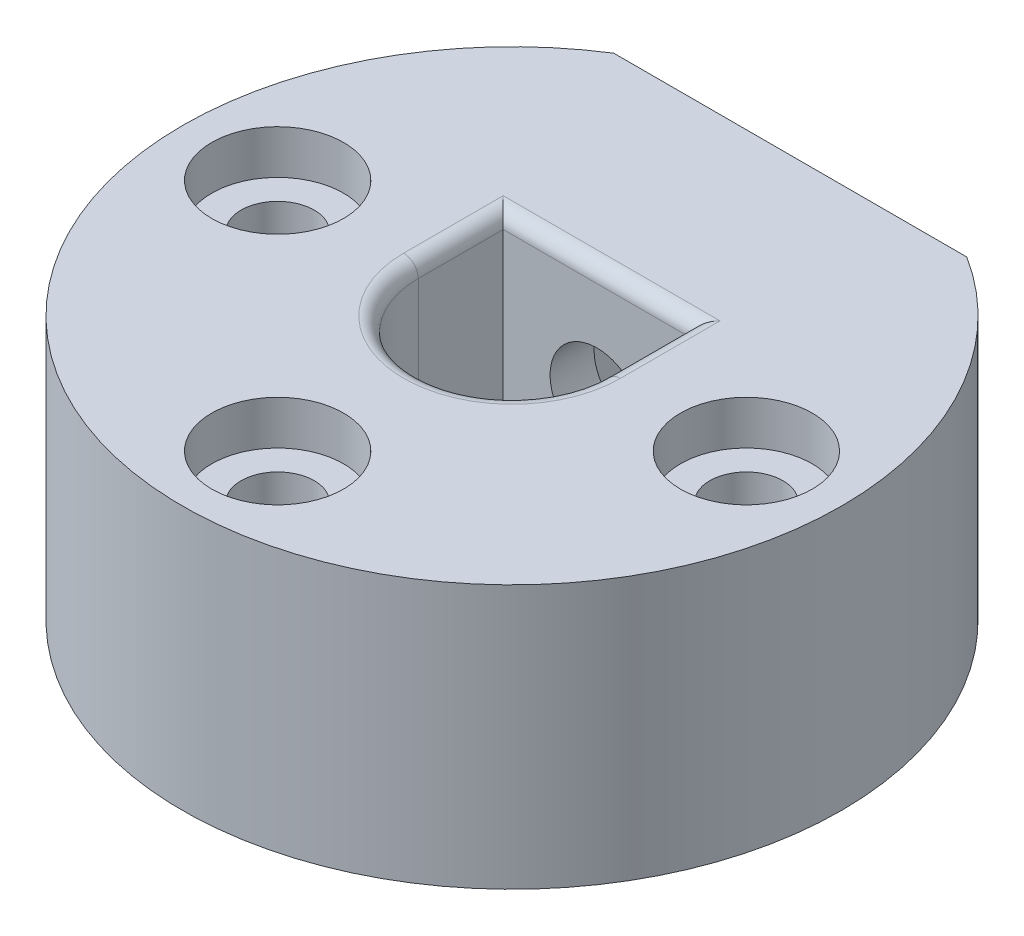
ISO-10303-21;
HEADER;
FILE_DESCRIPTION(('STEP AP214'),'2;1');
FILE_NAME('part.step','',(''),(''),'','','');
FILE_SCHEMA(('AUTOMOTIVE_DESIGN { 1 0 10303 214 1 1 1 1 }'));
ENDSEC;
DATA;
#1=APPLICATION_CONTEXT('core data for automotive mechanical design processes');
#2=APPLICATION_PROTOCOL_DEFINITION('international standard','automotive_design',2000,#1);
#3=PRODUCT_CONTEXT('',#1,'mechanical');
#4=PRODUCT('Part','Part','',(#3));
#5=PRODUCT_RELATED_PRODUCT_CATEGORY('part','',(#4));
#6=PRODUCT_DEFINITION_FORMATION('','',#4);
#7=PRODUCT_DEFINITION_CONTEXT('part definition',#1,'design');
#8=PRODUCT_DEFINITION('design','',#6,#7);
#9=PRODUCT_DEFINITION_SHAPE('','',#8);
#10=(LENGTH_UNIT() NAMED_UNIT(*) SI_UNIT(.MILLI.,.METRE.));
#11=(NAMED_UNIT(*) PLANE_ANGLE_UNIT() SI_UNIT($,.RADIAN.));
#12=(NAMED_UNIT(*) SI_UNIT($,.STERADIAN.) SOLID_ANGLE_UNIT());
#13=UNCERTAINTY_MEASURE_WITH_UNIT(LENGTH_MEASURE(1.E-05),#10,'distance_accuracy_value','');
#14=(GEOMETRIC_REPRESENTATION_CONTEXT(3) GLOBAL_UNCERTAINTY_ASSIGNED_CONTEXT((#13)) GLOBAL_UNIT_ASSIGNED_CONTEXT((#10,
#11,#12)) REPRESENTATION_CONTEXT('',''));
#15=CARTESIAN_POINT('',(0.,0.,0.));
#16=DIRECTION('',(0.,0.,1.));
#17=DIRECTION('',(1.,0.,0.));
#18=AXIS2_PLACEMENT_3D('',#15,#16,#17);
#19=CARTESIAN_POINT('',(0.,0.,0.));
#20=DIRECTION('',(0.,1.,0.));
#21=DIRECTION('',(0.,0.,1.));
#22=AXIS2_PLACEMENT_3D('',#19,#20,#21);
#23=PLANE('',#22);
#24=CARTESIAN_POINT('',(0.,0.,0.));
#25=DIRECTION('',(0.,1.,0.));
#26=DIRECTION('',(0.,0.,1.));
#27=AXIS2_PLACEMENT_3D('',#24,#25,#26);
#28=CIRCLE('',#27,3.2);
#29=CARTESIAN_POINT('',(-3.2,0.,0.));
#30=VERTEX_POINT('',#29);
#31=CARTESIAN_POINT('',(3.2,0.,0.));
#32=VERTEX_POINT('',#31);
#33=EDGE_CURVE('E219',#30,#32,#28,.T.);
#34=ORIENTED_EDGE('',*,*,#33,.T.);
#35=DIRECTION('',(0.,0.,-1.));
#36=VECTOR('',#35,1.);
#37=CARTESIAN_POINT('',(3.2,0.,0.));
#38=LINE('',#37,#36);
#39=CARTESIAN_POINT('',(3.2,0.,-2.9));
#40=VERTEX_POINT('',#39);
#41=EDGE_CURVE('E223',#32,#40,#38,.T.);
#42=ORIENTED_EDGE('',*,*,#41,.T.);
#43=DIRECTION('',(-1.,0.,0.));
#44=VECTOR('',#43,1.);
#45=CARTESIAN_POINT('',(3.2,0.,-2.9));
#46=LINE('',#45,#44);
#47=CARTESIAN_POINT('',(-3.2,0.,-2.9));
#48=VERTEX_POINT('',#47);
#49=EDGE_CURVE('E227',#40,#48,#46,.T.);
#50=ORIENTED_EDGE('',*,*,#49,.T.);
#51=DIRECTION('',(0.,0.,1.));
#52=VECTOR('',#51,1.);
#53=CARTESIAN_POINT('',(-3.2,0.,0.));
#54=LINE('',#53,#52);
#55=EDGE_CURVE('E231',#48,#30,#54,.T.);
#56=ORIENTED_EDGE('',*,*,#55,.T.);
#57=EDGE_LOOP('',(#34,#42,#50,#56));
#58=FACE_BOUND('',#57,.T.);
#59=CARTESIAN_POINT('',(0.,0.,0.));
#60=DIRECTION('',(0.,1.,0.));
#61=DIRECTION('',(0.,0.,1.));
#62=AXIS2_PLACEMENT_3D('',#59,#60,#61);
#63=CIRCLE('',#62,11.25);
#64=CARTESIAN_POINT('',(-6.02598539659698,0.,-9.5));
#65=VERTEX_POINT('',#64);
#66=CARTESIAN_POINT('',(6.02598539659698,0.,-9.5));
#67=VERTEX_POINT('',#66);
#68=EDGE_CURVE('E247',#65,#67,#63,.T.);
#69=ORIENTED_EDGE('',*,*,#68,.F.);
#70=DIRECTION('',(-1.,0.,0.));
#71=VECTOR('',#70,1.);
#72=CARTESIAN_POINT('',(6.02598539659698,0.,-9.5));
#73=LINE('',#72,#71);
#74=EDGE_CURVE('E253',#67,#65,#73,.T.);
#75=ORIENTED_EDGE('',*,*,#74,.F.);
#76=EDGE_LOOP('',(#69,#75));
#77=FACE_BOUND('',#76,.T.);
#78=CARTESIAN_POINT('',(0.,0.,8.));
#79=DIRECTION('',(0.,1.,0.));
#80=DIRECTION('',(0.,0.,1.));
#81=AXIS2_PLACEMENT_3D('',#78,#79,#80);
#82=CIRCLE('',#81,1.25);
#83=CARTESIAN_POINT('',(0.,0.,9.25));
#84=VERTEX_POINT('',#83);
#85=EDGE_CURVE('E215',#84,#84,#82,.T.);
#86=ORIENTED_EDGE('',*,*,#85,.T.);
#87=EDGE_LOOP('',(#86));
#88=FACE_BOUND('',#87,.T.);
#89=CARTESIAN_POINT('',(-8.,0.,-1.68080962984129E-13));
#90=DIRECTION('',(0.,1.,0.));
#91=DIRECTION('',(0.,0.,1.));
#92=AXIS2_PLACEMENT_3D('',#89,#90,#91);
#93=CIRCLE('',#92,1.25);
#94=CARTESIAN_POINT('',(-8.,0.,1.24999999999983));
#95=VERTEX_POINT('',#94);
#96=EDGE_CURVE('E199',#95,#95,#93,.T.);
#97=ORIENTED_EDGE('',*,*,#96,.T.);
#98=EDGE_LOOP('',(#97));
#99=FACE_BOUND('',#98,.T.);
#100=CARTESIAN_POINT('',(8.,0.,0.));
#101=DIRECTION('',(0.,1.,0.));
#102=DIRECTION('',(0.,0.,1.));
#103=AXIS2_PLACEMENT_3D('',#100,#101,#102);
#104=CIRCLE('',#103,1.25);
#105=CARTESIAN_POINT('',(8.,0.,1.25));
#106=VERTEX_POINT('',#105);
#107=EDGE_CURVE('E183',#106,#106,#104,.T.);
#108=ORIENTED_EDGE('',*,*,#107,.T.);
#109=EDGE_LOOP('',(#108));
#110=FACE_BOUND('',#109,.T.);
#111=DIRECTION('',(0.,0.,-1.));
#112=VECTOR('',#111,1.);
#113=CARTESIAN_POINT('',(2.925,0.,-4.4));
#114=LINE('',#113,#112);
#115=CARTESIAN_POINT('',(2.925,0.,-4.4));
#116=VERTEX_POINT('',#115);
#117=CARTESIAN_POINT('',(2.925,0.,-6.65));
#118=VERTEX_POINT('',#117);
#119=EDGE_CURVE('E57',#116,#118,#114,.T.);
#120=ORIENTED_EDGE('',*,*,#119,.T.);
#121=DIRECTION('',(-1.,0.,0.));
#122=VECTOR('',#121,1.);
#123=CARTESIAN_POINT('',(-2.925,0.,-6.65));
#124=LINE('',#123,#122);
#125=CARTESIAN_POINT('',(-2.925,0.,-6.65));
#126=VERTEX_POINT('',#125);
#127=EDGE_CURVE('E153',#118,#126,#124,.T.);
#128=ORIENTED_EDGE('',*,*,#127,.T.);
#129=DIRECTION('',(0.,0.,1.));
#130=VECTOR('',#129,1.);
#131=CARTESIAN_POINT('',(-2.925,0.,-4.4));
#132=LINE('',#131,#130);
#133=CARTESIAN_POINT('',(-2.925,0.,-4.4));
#134=VERTEX_POINT('',#133);
#135=EDGE_CURVE('E573',#126,#134,#132,.T.);
#136=ORIENTED_EDGE('',*,*,#135,.T.);
#137=DIRECTION('',(1.,0.,0.));
#138=VECTOR('',#137,1.);
#139=CARTESIAN_POINT('',(-2.925,0.,-4.4));
#140=LINE('',#139,#138);
#141=EDGE_CURVE('E148',#134,#116,#140,.T.);
#142=ORIENTED_EDGE('',*,*,#141,.T.);
#143=EDGE_LOOP('',(#120,#128,#136,#142));
#144=FACE_BOUND('',#143,.T.);
#145=ADVANCED_FACE('F39',(#58,#77,#88,#99,#110,#144),#23,.F.);
#146=CARTESIAN_POINT('',(0.,5.,-9.5));
#147=DIRECTION('',(0.,0.,1.));
#148=DIRECTION('',(1.,0.,0.));
#149=AXIS2_PLACEMENT_3D('',#146,#147,#148);
#150=CYLINDRICAL_SURFACE('',#149,1.6);
#151=CARTESIAN_POINT('',(0.,5.,-9.5));
#152=DIRECTION('',(0.,0.,1.));
#153=DIRECTION('',(1.,0.,0.));
#154=AXIS2_PLACEMENT_3D('',#151,#152,#153);
#155=CIRCLE('',#154,1.6);
#156=CARTESIAN_POINT('',(1.6,5.,-9.5));
#157=VERTEX_POINT('',#156);
#158=EDGE_CURVE('E165',#157,#157,#155,.T.);
#159=ORIENTED_EDGE('',*,*,#158,.F.);
#160=EDGE_LOOP('',(#159));
#161=FACE_BOUND('',#160,.T.);
#162=CARTESIAN_POINT('',(0.,5.,-6.65));
#163=DIRECTION('',(0.,0.,1.));
#164=DIRECTION('',(1.,0.,0.));
#165=AXIS2_PLACEMENT_3D('',#162,#163,#164);
#166=CIRCLE('',#165,1.6);
#167=CARTESIAN_POINT('',(1.6,5.,-6.65));
#168=VERTEX_POINT('',#167);
#169=EDGE_CURVE('E43',#168,#168,#166,.F.);
#170=ORIENTED_EDGE('',*,*,#169,.F.);
#171=EDGE_LOOP('',(#170));
#172=FACE_BOUND('',#171,.T.);
#173=ADVANCED_FACE('F350',(#161,#172),#150,.F.);
#174=CARTESIAN_POINT('',(0.,5.,-2.9));
#175=DIRECTION('',(0.,0.,1.));
#176=DIRECTION('',(1.,0.,0.));
#177=AXIS2_PLACEMENT_3D('',#174,#175,#176);
#178=CIRCLE('',#177,1.6);
#179=CARTESIAN_POINT('',(1.6,5.,-2.9));
#180=VERTEX_POINT('',#179);
#181=EDGE_CURVE('E169',#180,#180,#178,.T.);
#182=ORIENTED_EDGE('',*,*,#181,.T.);
#183=EDGE_LOOP('',(#182));
#184=FACE_BOUND('',#183,.T.);
#185=CARTESIAN_POINT('',(0.,5.,-4.4));
#186=DIRECTION('',(0.,0.,-1.));
#187=DIRECTION('',(-1.,0.,0.));
#188=AXIS2_PLACEMENT_3D('',#185,#186,#187);
#189=CIRCLE('',#188,1.6);
#190=CARTESIAN_POINT('',(-1.6,5.,-4.4));
#191=VERTEX_POINT('',#190);
#192=EDGE_CURVE('E155',#191,#191,#189,.F.);
#193=ORIENTED_EDGE('',*,*,#192,.F.);
#194=EDGE_LOOP('',(#193));
#195=FACE_BOUND('',#194,.T.);
#196=ADVANCED_FACE('F307',(#184,#195),#150,.F.);
#197=CARTESIAN_POINT('',(0.,9.,0.));
#198=DIRECTION('',(0.,1.,0.));
#199=DIRECTION('',(0.,0.,1.));
#200=AXIS2_PLACEMENT_3D('',#197,#198,#199);
#201=PLANE('',#200);
#202=DIRECTION('',(0.,0.,1.));
#203=VECTOR('',#202,1.);
#204=CARTESIAN_POINT('',(-3.7,9.,0.));
#205=LINE('',#204,#203);
#206=CARTESIAN_POINT('',(-3.7,9.,0.));
#207=VERTEX_POINT('',#206);
#208=CARTESIAN_POINT('',(-3.7,9.,-3.4));
#209=VERTEX_POINT('',#208);
#210=EDGE_CURVE('E279',#207,#209,#205,.F.);
#211=ORIENTED_EDGE('',*,*,#210,.T.);
#212=DIRECTION('',(-1.,0.,0.));
#213=VECTOR('',#212,1.);
#214=CARTESIAN_POINT('',(0.,9.,-3.4));
#215=LINE('',#214,#213);
#216=CARTESIAN_POINT('',(3.7,9.,-3.4));
#217=VERTEX_POINT('',#216);
#218=EDGE_CURVE('E283',#209,#217,#215,.F.);
#219=ORIENTED_EDGE('',*,*,#218,.T.);
#220=DIRECTION('',(0.,0.,-1.));
#221=VECTOR('',#220,1.);
#222=CARTESIAN_POINT('',(3.7,9.,0.));
#223=LINE('',#222,#221);
#224=CARTESIAN_POINT('',(3.7,9.,0.));
#225=VERTEX_POINT('',#224);
#226=EDGE_CURVE('E276',#217,#225,#223,.F.);
#227=ORIENTED_EDGE('',*,*,#226,.T.);
#228=CARTESIAN_POINT('',(0.,9.,0.));
#229=DIRECTION('',(0.,1.,0.));
#230=DIRECTION('',(0.,0.,1.));
#231=AXIS2_PLACEMENT_3D('',#228,#229,#230);
#232=CIRCLE('',#231,3.7);
#233=EDGE_CURVE('E273',#225,#207,#232,.F.);
#234=ORIENTED_EDGE('',*,*,#233,.T.);
#235=EDGE_LOOP('',(#211,#219,#227,#234));
#236=FACE_BOUND('',#235,.T.);
#237=CARTESIAN_POINT('',(8.,9.,0.));
#238=DIRECTION('',(0.,1.,0.));
#239=DIRECTION('',(0.,0.,1.));
#240=AXIS2_PLACEMENT_3D('',#237,#238,#239);
#241=CIRCLE('',#240,2.25);
#242=CARTESIAN_POINT('',(8.,9.,2.25));
#243=VERTEX_POINT('',#242);
#244=EDGE_CURVE('E170',#243,#243,#241,.T.);
#245=ORIENTED_EDGE('',*,*,#244,.F.);
#246=EDGE_LOOP('',(#245));
#247=FACE_BOUND('',#246,.T.);
#248=CARTESIAN_POINT('',(-8.,9.,-1.68080962984129E-13));
#249=DIRECTION('',(0.,1.,0.));
#250=DIRECTION('',(0.,0.,1.));
#251=AXIS2_PLACEMENT_3D('',#248,#249,#250);
#252=CIRCLE('',#251,2.25);
#253=CARTESIAN_POINT('',(-8.,9.,2.24999999999983));
#254=VERTEX_POINT('',#253);
#255=EDGE_CURVE('E187',#254,#254,#252,.T.);
#256=ORIENTED_EDGE('',*,*,#255,.F.);
#257=EDGE_LOOP('',(#256));
#258=FACE_BOUND('',#257,.T.);
#259=CARTESIAN_POINT('',(0.,9.,8.));
#260=DIRECTION('',(0.,1.,0.));
#261=DIRECTION('',(0.,0.,1.));
#262=AXIS2_PLACEMENT_3D('',#259,#260,#261);
#263=CIRCLE('',#262,2.25);
#264=CARTESIAN_POINT('',(0.,9.,10.25));
#265=VERTEX_POINT('',#264);
#266=EDGE_CURVE('E203',#265,#265,#263,.T.);
#267=ORIENTED_EDGE('',*,*,#266,.F.);
#268=EDGE_LOOP('',(#267));
#269=FACE_BOUND('',#268,.T.);
#270=CARTESIAN_POINT('',(0.,9.,0.));
#271=DIRECTION('',(0.,1.,0.));
#272=DIRECTION('',(0.,0.,1.));
#273=AXIS2_PLACEMENT_3D('',#270,#271,#272);
#274=CIRCLE('',#273,11.25);
#275=CARTESIAN_POINT('',(-6.02598539659698,9.,-9.5));
#276=VERTEX_POINT('',#275);
#277=CARTESIAN_POINT('',(6.02598539659698,9.,-9.5));
#278=VERTEX_POINT('',#277);
#279=EDGE_CURVE('E248',#276,#278,#274,.T.);
#280=ORIENTED_EDGE('',*,*,#279,.T.);
#281=DIRECTION('',(-1.,0.,0.));
#282=VECTOR('',#281,1.);
#283=CARTESIAN_POINT('',(6.02598539659698,9.,-9.5));
#284=LINE('',#283,#282);
#285=EDGE_CURVE('E252',#278,#276,#284,.T.);
#286=ORIENTED_EDGE('',*,*,#285,.T.);
#287=EDGE_LOOP('',(#280,#286));
#288=FACE_BOUND('',#287,.T.);
#289=ADVANCED_FACE('F359',(#236,#247,#258,#269,#288),#201,.T.);
#290=CARTESIAN_POINT('',(0.,9.,0.));
#291=DIRECTION('',(0.,-1.,0.));
#292=DIRECTION('',(0.,0.,-1.));
#293=AXIS2_PLACEMENT_3D('',#290,#291,#292);
#294=CYLINDRICAL_SURFACE('',#293,11.25);
#295=ORIENTED_EDGE('',*,*,#68,.T.);
#296=DIRECTION('',(0.,-1.,0.));
#297=VECTOR('',#296,1.);
#298=CARTESIAN_POINT('',(6.02598539659698,9.,-9.5));
#299=LINE('',#298,#297);
#300=EDGE_CURVE('E265',#278,#67,#299,.T.);
#301=ORIENTED_EDGE('',*,*,#300,.F.);
#302=ORIENTED_EDGE('',*,*,#279,.F.);
#303=DIRECTION('',(0.,-1.,0.));
#304=VECTOR('',#303,1.);
#305=CARTESIAN_POINT('',(-6.02598539659698,9.,-9.5));
#306=LINE('',#305,#304);
#307=EDGE_CURVE('E256',#276,#65,#306,.T.);
#308=ORIENTED_EDGE('',*,*,#307,.T.);
#309=EDGE_LOOP('',(#295,#301,#302,#308));
#310=FACE_BOUND('',#309,.T.);
#311=ADVANCED_FACE('F362',(#310),#294,.T.);
#312=CARTESIAN_POINT('',(6.02598539659698,9.,-9.5));
#313=DIRECTION('',(0.,0.,1.));
#314=DIRECTION('',(1.,0.,0.));
#315=AXIS2_PLACEMENT_3D('',#312,#313,#314);
#316=PLANE('',#315);
#317=ORIENTED_EDGE('',*,*,#158,.T.);
#318=EDGE_LOOP('',(#317));
#319=FACE_BOUND('',#318,.T.);
#320=ORIENTED_EDGE('',*,*,#74,.T.);
#321=ORIENTED_EDGE('',*,*,#307,.F.);
#322=ORIENTED_EDGE('',*,*,#285,.F.);
#323=ORIENTED_EDGE('',*,*,#300,.T.);
#324=EDGE_LOOP('',(#320,#321,#322,#323));
#325=FACE_BOUND('',#324,.T.);
#326=ADVANCED_FACE('F347',(#319,#325),#316,.F.);
#327=CARTESIAN_POINT('',(0.,9.,0.));
#328=DIRECTION('',(0.,-1.,0.));
#329=DIRECTION('',(0.,0.,-1.));
#330=AXIS2_PLACEMENT_3D('',#327,#328,#329);
#331=CYLINDRICAL_SURFACE('',#330,3.2);
#332=DIRECTION('',(0.,-1.,0.));
#333=VECTOR('',#332,1.);
#334=CARTESIAN_POINT('',(-3.2,9.,0.));
#335=LINE('',#334,#333);
#336=CARTESIAN_POINT('',(-3.2,8.5,0.));
#337=VERTEX_POINT('',#336);
#338=EDGE_CURVE('E235',#337,#30,#335,.T.);
#339=ORIENTED_EDGE('',*,*,#338,.F.);
#340=CARTESIAN_POINT('',(0.,8.5,0.));
#341=DIRECTION('',(0.,1.,0.));
#342=DIRECTION('',(0.,0.,1.));
#343=AXIS2_PLACEMENT_3D('',#340,#341,#342);
#344=CIRCLE('',#343,3.2);
#345=CARTESIAN_POINT('',(3.2,8.5,0.));
#346=VERTEX_POINT('',#345);
#347=EDGE_CURVE('E11',#337,#346,#344,.T.);
#348=ORIENTED_EDGE('',*,*,#347,.T.);
#349=DIRECTION('',(0.,-1.,0.));
#350=VECTOR('',#349,1.);
#351=CARTESIAN_POINT('',(3.2,9.,0.));
#352=LINE('',#351,#350);
#353=EDGE_CURVE('E244',#346,#32,#352,.T.);
#354=ORIENTED_EDGE('',*,*,#353,.T.);
#355=ORIENTED_EDGE('',*,*,#33,.F.);
#356=EDGE_LOOP('',(#339,#348,#354,#355));
#357=FACE_BOUND('',#356,.T.);
#358=ADVANCED_FACE('F339',(#357),#331,.F.);
#359=CARTESIAN_POINT('',(3.2,9.,0.));
#360=DIRECTION('',(-1.,0.,0.));
#361=DIRECTION('',(0.,0.,1.));
#362=AXIS2_PLACEMENT_3D('',#359,#360,#361);
#363=PLANE('',#362);
#364=ORIENTED_EDGE('',*,*,#353,.F.);
#365=DIRECTION('',(0.,0.,-1.));
#366=VECTOR('',#365,1.);
#367=CARTESIAN_POINT('',(3.2,8.5,0.));
#368=LINE('',#367,#366);
#369=CARTESIAN_POINT('',(3.2,8.5,-2.9));
#370=VERTEX_POINT('',#369);
#371=EDGE_CURVE('E65',#346,#370,#368,.T.);
#372=ORIENTED_EDGE('',*,*,#371,.T.);
#373=DIRECTION('',(0.,-1.,0.));
#374=VECTOR('',#373,1.);
#375=CARTESIAN_POINT('',(3.2,9.,-2.9));
#376=LINE('',#375,#374);
#377=EDGE_CURVE('E241',#370,#40,#376,.T.);
#378=ORIENTED_EDGE('',*,*,#377,.T.);
#379=ORIENTED_EDGE('',*,*,#41,.F.);
#380=EDGE_LOOP('',(#364,#372,#378,#379));
#381=FACE_BOUND('',#380,.T.);
#382=ADVANCED_FACE('F314',(#381),#363,.T.);
#383=CARTESIAN_POINT('',(3.2,9.,-2.9));
#384=DIRECTION('',(0.,0.,1.));
#385=DIRECTION('',(1.,0.,0.));
#386=AXIS2_PLACEMENT_3D('',#383,#384,#385);
#387=PLANE('',#386);
#388=ORIENTED_EDGE('',*,*,#181,.F.);
#389=EDGE_LOOP('',(#388));
#390=FACE_BOUND('',#389,.T.);
#391=ORIENTED_EDGE('',*,*,#377,.F.);
#392=DIRECTION('',(-1.,0.,0.));
#393=VECTOR('',#392,1.);
#394=CARTESIAN_POINT('',(3.2,8.5,-2.9));
#395=LINE('',#394,#393);
#396=CARTESIAN_POINT('',(-3.2,8.5,-2.9));
#397=VERTEX_POINT('',#396);
#398=EDGE_CURVE('E49',#370,#397,#395,.T.);
#399=ORIENTED_EDGE('',*,*,#398,.T.);
#400=DIRECTION('',(0.,-1.,0.));
#401=VECTOR('',#400,1.);
#402=CARTESIAN_POINT('',(-3.2,9.,-2.9));
#403=LINE('',#402,#401);
#404=EDGE_CURVE('E238',#397,#48,#403,.T.);
#405=ORIENTED_EDGE('',*,*,#404,.T.);
#406=ORIENTED_EDGE('',*,*,#49,.F.);
#407=EDGE_LOOP('',(#391,#399,#405,#406));
#408=FACE_BOUND('',#407,.T.);
#409=ADVANCED_FACE('F310',(#390,#408),#387,.T.);
#410=CARTESIAN_POINT('',(-3.2,9.,0.));
#411=DIRECTION('',(1.,0.,0.));
#412=DIRECTION('',(0.,0.,-1.));
#413=AXIS2_PLACEMENT_3D('',#410,#411,#412);
#414=PLANE('',#413);
#415=ORIENTED_EDGE('',*,*,#404,.F.);
#416=DIRECTION('',(0.,0.,1.));
#417=VECTOR('',#416,1.);
#418=CARTESIAN_POINT('',(-3.2,8.5,0.));
#419=LINE('',#418,#417);
#420=EDGE_CURVE('E269',#397,#337,#419,.T.);
#421=ORIENTED_EDGE('',*,*,#420,.T.);
#422=ORIENTED_EDGE('',*,*,#338,.T.);
#423=ORIENTED_EDGE('',*,*,#55,.F.);
#424=EDGE_LOOP('',(#415,#421,#422,#423));
#425=FACE_BOUND('',#424,.T.);
#426=ADVANCED_FACE('F313',(#425),#414,.T.);
#427=CARTESIAN_POINT('',(0.,9.,8.));
#428=DIRECTION('',(0.,1.,0.));
#429=DIRECTION('',(0.,0.,1.));
#430=AXIS2_PLACEMENT_3D('',#427,#428,#429);
#431=CYLINDRICAL_SURFACE('',#430,1.25);
#432=ORIENTED_EDGE('',*,*,#85,.F.);
#433=EDGE_LOOP('',(#432));
#434=FACE_BOUND('',#433,.T.);
#435=CARTESIAN_POINT('',(0.,7.5,8.));
#436=DIRECTION('',(0.,1.,0.));
#437=DIRECTION('',(0.,0.,1.));
#438=AXIS2_PLACEMENT_3D('',#435,#436,#437);
#439=CIRCLE('',#438,1.25);
#440=CARTESIAN_POINT('',(0.,7.5,9.25));
#441=VERTEX_POINT('',#440);
#442=EDGE_CURVE('E211',#441,#441,#439,.T.);
#443=ORIENTED_EDGE('',*,*,#442,.T.);
#444=EDGE_LOOP('',(#443));
#445=FACE_BOUND('',#444,.T.);
#446=ADVANCED_FACE('F415',(#434,#445),#431,.F.);
#447=CARTESIAN_POINT('',(1.24999999999997,7.5,8.));
#448=DIRECTION('',(0.,-1.,0.));
#449=DIRECTION('',(0.,0.,-1.));
#450=AXIS2_PLACEMENT_3D('',#447,#448,#449);
#451=PLANE('',#450);
#452=ORIENTED_EDGE('',*,*,#442,.F.);
#453=EDGE_LOOP('',(#452));
#454=FACE_BOUND('',#453,.T.);
#455=CARTESIAN_POINT('',(0.,7.5,8.));
#456=DIRECTION('',(0.,1.,0.));
#457=DIRECTION('',(0.,0.,1.));
#458=AXIS2_PLACEMENT_3D('',#455,#456,#457);
#459=CIRCLE('',#458,2.25);
#460=CARTESIAN_POINT('',(0.,7.5,10.25));
#461=VERTEX_POINT('',#460);
#462=EDGE_CURVE('E207',#461,#461,#459,.T.);
#463=ORIENTED_EDGE('',*,*,#462,.T.);
#464=EDGE_LOOP('',(#463));
#465=FACE_BOUND('',#464,.T.);
#466=ADVANCED_FACE('F411',(#454,#465),#451,.F.);
#467=CARTESIAN_POINT('',(0.,9.,8.));
#468=DIRECTION('',(0.,1.,0.));
#469=DIRECTION('',(0.,0.,1.));
#470=AXIS2_PLACEMENT_3D('',#467,#468,#469);
#471=CYLINDRICAL_SURFACE('',#470,2.25);
#472=ORIENTED_EDGE('',*,*,#462,.F.);
#473=EDGE_LOOP('',(#472));
#474=FACE_BOUND('',#473,.T.);
#475=ORIENTED_EDGE('',*,*,#266,.T.);
#476=EDGE_LOOP('',(#475));
#477=FACE_BOUND('',#476,.T.);
#478=ADVANCED_FACE('F407',(#474,#477),#471,.F.);
#479=CARTESIAN_POINT('',(-8.,9.,-1.68080962984129E-13));
#480=DIRECTION('',(0.,1.,0.));
#481=DIRECTION('',(0.,0.,1.));
#482=AXIS2_PLACEMENT_3D('',#479,#480,#481);
#483=CYLINDRICAL_SURFACE('',#482,1.25);
#484=ORIENTED_EDGE('',*,*,#96,.F.);
#485=EDGE_LOOP('',(#484));
#486=FACE_BOUND('',#485,.T.);
#487=CARTESIAN_POINT('',(-8.,7.5,-1.68080962984129E-13));
#488=DIRECTION('',(0.,1.,0.));
#489=DIRECTION('',(0.,0.,1.));
#490=AXIS2_PLACEMENT_3D('',#487,#488,#489);
#491=CIRCLE('',#490,1.25);
#492=CARTESIAN_POINT('',(-8.,7.5,1.24999999999983));
#493=VERTEX_POINT('',#492);
#494=EDGE_CURVE('E195',#493,#493,#491,.T.);
#495=ORIENTED_EDGE('',*,*,#494,.T.);
#496=EDGE_LOOP('',(#495));
#497=FACE_BOUND('',#496,.T.);
#498=ADVANCED_FACE('F403',(#486,#497),#483,.F.);
#499=CARTESIAN_POINT('',(-6.75,7.5,-1.68080962984129E-13));
#500=DIRECTION('',(0.,-1.,0.));
#501=DIRECTION('',(0.,0.,-1.));
#502=AXIS2_PLACEMENT_3D('',#499,#500,#501);
#503=PLANE('',#502);
#504=ORIENTED_EDGE('',*,*,#494,.F.);
#505=EDGE_LOOP('',(#504));
#506=FACE_BOUND('',#505,.T.);
#507=CARTESIAN_POINT('',(-8.,7.5,-1.68080962984129E-13));
#508=DIRECTION('',(0.,1.,0.));
#509=DIRECTION('',(0.,0.,1.));
#510=AXIS2_PLACEMENT_3D('',#507,#508,#509);
#511=CIRCLE('',#510,2.25);
#512=CARTESIAN_POINT('',(-8.,7.5,2.24999999999983));
#513=VERTEX_POINT('',#512);
#514=EDGE_CURVE('E191',#513,#513,#511,.T.);
#515=ORIENTED_EDGE('',*,*,#514,.T.);
#516=EDGE_LOOP('',(#515));
#517=FACE_BOUND('',#516,.T.);
#518=ADVANCED_FACE('F399',(#506,#517),#503,.F.);
#519=CARTESIAN_POINT('',(-8.,9.,-1.68080962984129E-13));
#520=DIRECTION('',(0.,1.,0.));
#521=DIRECTION('',(0.,0.,1.));
#522=AXIS2_PLACEMENT_3D('',#519,#520,#521);
#523=CYLINDRICAL_SURFACE('',#522,2.25);
#524=ORIENTED_EDGE('',*,*,#514,.F.);
#525=EDGE_LOOP('',(#524));
#526=FACE_BOUND('',#525,.T.);
#527=ORIENTED_EDGE('',*,*,#255,.T.);
#528=EDGE_LOOP('',(#527));
#529=FACE_BOUND('',#528,.T.);
#530=ADVANCED_FACE('F395',(#526,#529),#523,.F.);
#531=CARTESIAN_POINT('',(8.,9.,0.));
#532=DIRECTION('',(0.,1.,0.));
#533=DIRECTION('',(0.,0.,1.));
#534=AXIS2_PLACEMENT_3D('',#531,#532,#533);
#535=CYLINDRICAL_SURFACE('',#534,1.25);
#536=ORIENTED_EDGE('',*,*,#107,.F.);
#537=EDGE_LOOP('',(#536));
#538=FACE_BOUND('',#537,.T.);
#539=CARTESIAN_POINT('',(8.,7.5,0.));
#540=DIRECTION('',(0.,1.,0.));
#541=DIRECTION('',(0.,0.,1.));
#542=AXIS2_PLACEMENT_3D('',#539,#540,#541);
#543=CIRCLE('',#542,1.25);
#544=CARTESIAN_POINT('',(8.,7.5,1.25));
#545=VERTEX_POINT('',#544);
#546=EDGE_CURVE('E179',#545,#545,#543,.T.);
#547=ORIENTED_EDGE('',*,*,#546,.T.);
#548=EDGE_LOOP('',(#547));
#549=FACE_BOUND('',#548,.T.);
#550=ADVANCED_FACE('F386',(#538,#549),#535,.F.);
#551=CARTESIAN_POINT('',(9.25,7.5,0.));
#552=DIRECTION('',(0.,-1.,0.));
#553=DIRECTION('',(0.,0.,-1.));
#554=AXIS2_PLACEMENT_3D('',#551,#552,#553);
#555=PLANE('',#554);
#556=ORIENTED_EDGE('',*,*,#546,.F.);
#557=EDGE_LOOP('',(#556));
#558=FACE_BOUND('',#557,.T.);
#559=CARTESIAN_POINT('',(8.,7.5,0.));
#560=DIRECTION('',(0.,1.,0.));
#561=DIRECTION('',(0.,0.,1.));
#562=AXIS2_PLACEMENT_3D('',#559,#560,#561);
#563=CIRCLE('',#562,2.25);
#564=CARTESIAN_POINT('',(8.,7.5,2.25));
#565=VERTEX_POINT('',#564);
#566=EDGE_CURVE('E174',#565,#565,#563,.T.);
#567=ORIENTED_EDGE('',*,*,#566,.T.);
#568=EDGE_LOOP('',(#567));
#569=FACE_BOUND('',#568,.T.);
#570=ADVANCED_FACE('F380',(#558,#569),#555,.F.);
#571=CARTESIAN_POINT('',(8.,9.,0.));
#572=DIRECTION('',(0.,1.,0.));
#573=DIRECTION('',(0.,0.,1.));
#574=AXIS2_PLACEMENT_3D('',#571,#572,#573);
#575=CYLINDRICAL_SURFACE('',#574,2.25);
#576=ORIENTED_EDGE('',*,*,#566,.F.);
#577=EDGE_LOOP('',(#576));
#578=FACE_BOUND('',#577,.T.);
#579=ORIENTED_EDGE('',*,*,#244,.T.);
#580=EDGE_LOOP('',(#579));
#581=FACE_BOUND('',#580,.T.);
#582=ADVANCED_FACE('F376',(#578,#581),#575,.F.);
#583=CARTESIAN_POINT('',(3.7,8.5,0.));
#584=DIRECTION('',(0.,0.,-1.));
#585=DIRECTION('',(-1.,0.,0.));
#586=AXIS2_PLACEMENT_3D('',#583,#584,#585);
#587=CYLINDRICAL_SURFACE('',#586,0.5);
#588=CARTESIAN_POINT('',(3.7,8.5,0.));
#589=DIRECTION('',(0.,0.,1.));
#590=DIRECTION('',(1.,0.,0.));
#591=AXIS2_PLACEMENT_3D('',#588,#589,#590);
#592=CIRCLE('',#591,0.5);
#593=EDGE_CURVE('E296',#225,#346,#592,.T.);
#594=ORIENTED_EDGE('',*,*,#593,.F.);
#595=ORIENTED_EDGE('',*,*,#226,.F.);
#596=CARTESIAN_POINT('',(3.7,8.5,-3.4));
#597=DIRECTION('',(-0.707106781186548,0.,-0.707106781186547));
#598=DIRECTION('',(0.707106781186547,0.,-0.707106781186548));
#599=AXIS2_PLACEMENT_3D('',#596,#597,#598);
#600=ELLIPSE('',#599,0.707106781186547,0.5);
#601=EDGE_CURVE('E175',#370,#217,#600,.T.);
#602=ORIENTED_EDGE('',*,*,#601,.F.);
#603=ORIENTED_EDGE('',*,*,#371,.F.);
#604=EDGE_LOOP('',(#594,#595,#602,#603));
#605=FACE_BOUND('',#604,.T.);
#606=ADVANCED_FACE('F41',(#605),#587,.T.);
#607=CARTESIAN_POINT('',(3.2,8.5,-3.4));
#608=DIRECTION('',(-1.,0.,0.));
#609=DIRECTION('',(0.,0.,1.));
#610=AXIS2_PLACEMENT_3D('',#607,#608,#609);
#611=CYLINDRICAL_SURFACE('',#610,0.5);
#612=ORIENTED_EDGE('',*,*,#601,.T.);
#613=ORIENTED_EDGE('',*,*,#218,.F.);
#614=CARTESIAN_POINT('',(-3.7,8.5,-3.4));
#615=DIRECTION('',(-0.707106781186548,0.,0.707106781186547));
#616=DIRECTION('',(0.707106781186547,0.,0.707106781186548));
#617=AXIS2_PLACEMENT_3D('',#614,#615,#616);
#618=ELLIPSE('',#617,0.707106781186547,0.5);
#619=EDGE_CURVE('E293',#397,#209,#618,.T.);
#620=ORIENTED_EDGE('',*,*,#619,.F.);
#621=ORIENTED_EDGE('',*,*,#398,.F.);
#622=EDGE_LOOP('',(#612,#613,#620,#621));
#623=FACE_BOUND('',#622,.T.);
#624=ADVANCED_FACE('F327',(#623),#611,.T.);
#625=CARTESIAN_POINT('',(0.,8.5,0.));
#626=DIRECTION('',(0.,1.,0.));
#627=DIRECTION('',(0.,0.,1.));
#628=AXIS2_PLACEMENT_3D('',#625,#626,#627);
#629=TOROIDAL_SURFACE('',#628,3.7,0.5);
#630=ORIENTED_EDGE('',*,*,#593,.T.);
#631=ORIENTED_EDGE('',*,*,#347,.F.);
#632=CARTESIAN_POINT('',(-3.7,8.5,0.));
#633=DIRECTION('',(0.,0.,-1.));
#634=DIRECTION('',(-1.,0.,0.));
#635=AXIS2_PLACEMENT_3D('',#632,#633,#634);
#636=CIRCLE('',#635,0.5);
#637=EDGE_CURVE('E290',#207,#337,#636,.T.);
#638=ORIENTED_EDGE('',*,*,#637,.F.);
#639=ORIENTED_EDGE('',*,*,#233,.F.);
#640=EDGE_LOOP('',(#630,#631,#638,#639));
#641=FACE_BOUND('',#640,.T.);
#642=ADVANCED_FACE('F369',(#641),#629,.T.);
#643=CARTESIAN_POINT('',(-3.7,8.5,0.));
#644=DIRECTION('',(0.,0.,1.));
#645=DIRECTION('',(1.,0.,0.));
#646=AXIS2_PLACEMENT_3D('',#643,#644,#645);
#647=CYLINDRICAL_SURFACE('',#646,0.5);
#648=ORIENTED_EDGE('',*,*,#619,.T.);
#649=ORIENTED_EDGE('',*,*,#210,.F.);
#650=ORIENTED_EDGE('',*,*,#637,.T.);
#651=ORIENTED_EDGE('',*,*,#420,.F.);
#652=EDGE_LOOP('',(#648,#649,#650,#651));
#653=FACE_BOUND('',#652,.T.);
#654=ADVANCED_FACE('F331',(#653),#647,.T.);
#655=CARTESIAN_POINT('',(-2.925,7.25,-6.65));
#656=DIRECTION('',(0.,0.,1.));
#657=DIRECTION('',(1.,0.,0.));
#658=AXIS2_PLACEMENT_3D('',#655,#656,#657);
#659=PLANE('',#658);
#660=ORIENTED_EDGE('',*,*,#127,.F.);
#661=DIRECTION('',(0.,-1.,0.));
#662=VECTOR('',#661,1.);
#663=CARTESIAN_POINT('',(2.925,7.25,-6.65));
#664=LINE('',#663,#662);
#665=CARTESIAN_POINT('',(2.925,7.25,-6.65));
#666=VERTEX_POINT('',#665);
#667=EDGE_CURVE('E145',#666,#118,#664,.T.);
#668=ORIENTED_EDGE('',*,*,#667,.F.);
#669=DIRECTION('',(-1.,0.,0.));
#670=VECTOR('',#669,1.);
#671=CARTESIAN_POINT('',(-2.925,7.25,-6.65));
#672=LINE('',#671,#670);
#673=CARTESIAN_POINT('',(-2.925,7.25,-6.65));
#674=VERTEX_POINT('',#673);
#675=EDGE_CURVE('E133',#666,#674,#672,.T.);
#676=ORIENTED_EDGE('',*,*,#675,.T.);
#677=DIRECTION('',(0.,-1.,0.));
#678=VECTOR('',#677,1.);
#679=CARTESIAN_POINT('',(-2.925,7.25,-6.65));
#680=LINE('',#679,#678);
#681=EDGE_CURVE('E156',#674,#126,#680,.T.);
#682=ORIENTED_EDGE('',*,*,#681,.T.);
#683=EDGE_LOOP('',(#660,#668,#676,#682));
#684=FACE_BOUND('',#683,.T.);
#685=ORIENTED_EDGE('',*,*,#169,.T.);
#686=EDGE_LOOP('',(#685));
#687=FACE_BOUND('',#686,.T.);
#688=ADVANCED_FACE('F150',(#684,#687),#659,.T.);
#689=CARTESIAN_POINT('',(-2.925,7.25,-4.4));
#690=DIRECTION('',(0.,0.,-1.));
#691=DIRECTION('',(-1.,0.,0.));
#692=AXIS2_PLACEMENT_3D('',#689,#690,#691);
#693=PLANE('',#692);
#694=ORIENTED_EDGE('',*,*,#141,.F.);
#695=DIRECTION('',(0.,-1.,0.));
#696=VECTOR('',#695,1.);
#697=CARTESIAN_POINT('',(-2.925,7.25,-4.4));
#698=LINE('',#697,#696);
#699=CARTESIAN_POINT('',(-2.925,7.25,-4.4));
#700=VERTEX_POINT('',#699);
#701=EDGE_CURVE('E161',#700,#134,#698,.T.);
#702=ORIENTED_EDGE('',*,*,#701,.F.);
#703=DIRECTION('',(1.,0.,0.));
#704=VECTOR('',#703,1.);
#705=CARTESIAN_POINT('',(-2.925,7.25,-4.4));
#706=LINE('',#705,#704);
#707=CARTESIAN_POINT('',(2.925,7.25,-4.4));
#708=VERTEX_POINT('',#707);
#709=EDGE_CURVE('E589',#700,#708,#706,.T.);
#710=ORIENTED_EDGE('',*,*,#709,.T.);
#711=DIRECTION('',(0.,-1.,0.));
#712=VECTOR('',#711,1.);
#713=CARTESIAN_POINT('',(2.925,7.25,-4.4));
#714=LINE('',#713,#712);
#715=EDGE_CURVE('E146',#708,#116,#714,.T.);
#716=ORIENTED_EDGE('',*,*,#715,.T.);
#717=EDGE_LOOP('',(#694,#702,#710,#716));
#718=FACE_BOUND('',#717,.T.);
#719=ORIENTED_EDGE('',*,*,#192,.T.);
#720=EDGE_LOOP('',(#719));
#721=FACE_BOUND('',#720,.T.);
#722=ADVANCED_FACE('F533',(#718,#721),#693,.T.);
#723=CARTESIAN_POINT('',(2.925,7.25,-4.4));
#724=DIRECTION('',(-1.,0.,0.));
#725=DIRECTION('',(0.,0.,1.));
#726=AXIS2_PLACEMENT_3D('',#723,#724,#725);
#727=PLANE('',#726);
#728=ORIENTED_EDGE('',*,*,#119,.F.);
#729=ORIENTED_EDGE('',*,*,#715,.F.);
#730=DIRECTION('',(0.,0.,-1.));
#731=VECTOR('',#730,1.);
#732=CARTESIAN_POINT('',(2.925,7.25,-4.4));
#733=LINE('',#732,#731);
#734=EDGE_CURVE('E137',#708,#666,#733,.T.);
#735=ORIENTED_EDGE('',*,*,#734,.T.);
#736=ORIENTED_EDGE('',*,*,#667,.T.);
#737=EDGE_LOOP('',(#728,#729,#735,#736));
#738=FACE_BOUND('',#737,.T.);
#739=ADVANCED_FACE('F144',(#738),#727,.T.);
#740=CARTESIAN_POINT('',(-2.925,7.25,-4.4));
#741=DIRECTION('',(1.,0.,0.));
#742=DIRECTION('',(0.,0.,-1.));
#743=AXIS2_PLACEMENT_3D('',#740,#741,#742);
#744=PLANE('',#743);
#745=ORIENTED_EDGE('',*,*,#135,.F.);
#746=ORIENTED_EDGE('',*,*,#681,.F.);
#747=DIRECTION('',(0.,0.,1.));
#748=VECTOR('',#747,1.);
#749=CARTESIAN_POINT('',(-2.925,7.25,-4.4));
#750=LINE('',#749,#748);
#751=EDGE_CURVE('E138',#674,#700,#750,.T.);
#752=ORIENTED_EDGE('',*,*,#751,.T.);
#753=ORIENTED_EDGE('',*,*,#701,.T.);
#754=EDGE_LOOP('',(#745,#746,#752,#753));
#755=FACE_BOUND('',#754,.T.);
#756=ADVANCED_FACE('F551',(#755),#744,.T.);
#757=CARTESIAN_POINT('',(0.,7.25,0.));
#758=DIRECTION('',(0.,-1.,0.));
#759=DIRECTION('',(0.,0.,-1.));
#760=AXIS2_PLACEMENT_3D('',#757,#758,#759);
#761=PLANE('',#760);
#762=ORIENTED_EDGE('',*,*,#734,.F.);
#763=ORIENTED_EDGE('',*,*,#709,.F.);
#764=ORIENTED_EDGE('',*,*,#751,.F.);
#765=ORIENTED_EDGE('',*,*,#675,.F.);
#766=EDGE_LOOP('',(#762,#763,#764,#765));
#767=FACE_BOUND('',#766,.T.);
#768=ADVANCED_FACE('F135',(#767),#761,.T.);
#769=CLOSED_SHELL('',(#145,#173,#196,#289,#311,#326,#358,#382,#409,#426,#446,#466,#478,#498,
#518,#530,#550,#570,#582,#606,#624,#642,#654,#688,#722,#739,#756,#768));
#770=MANIFOLD_SOLID_BREP('B2',#769);
#771=ADVANCED_BREP_SHAPE_REPRESENTATION('',(#18,#770),#14);
#772=SHAPE_DEFINITION_REPRESENTATION(#9,#771);
ENDSEC;
END-ISO-10303-21;
